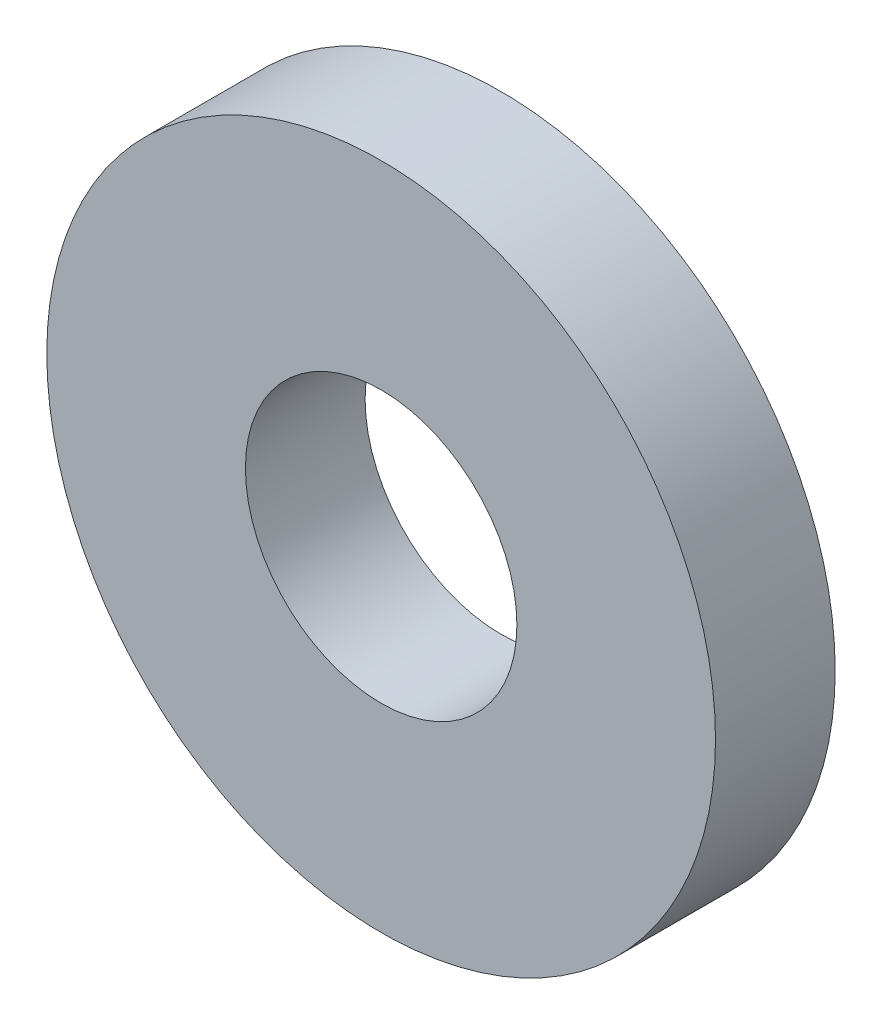
ISO-10303-21;
HEADER;
FILE_DESCRIPTION(('STEP AP214'),'2;1');
FILE_NAME('part.step','',(''),(''),'','','');
FILE_SCHEMA(('AUTOMOTIVE_DESIGN { 1 0 10303 214 1 1 1 1 }'));
ENDSEC;
DATA;
#1=APPLICATION_CONTEXT('core data for automotive mechanical design processes');
#2=APPLICATION_PROTOCOL_DEFINITION('international standard','automotive_design',2000,#1);
#3=PRODUCT_CONTEXT('',#1,'mechanical');
#4=PRODUCT('Part','Part','',(#3));
#5=PRODUCT_RELATED_PRODUCT_CATEGORY('part','',(#4));
#6=PRODUCT_DEFINITION_FORMATION('','',#4);
#7=PRODUCT_DEFINITION_CONTEXT('part definition',#1,'design');
#8=PRODUCT_DEFINITION('design','',#6,#7);
#9=PRODUCT_DEFINITION_SHAPE('','',#8);
#10=(LENGTH_UNIT() NAMED_UNIT(*) SI_UNIT(.MILLI.,.METRE.));
#11=(NAMED_UNIT(*) PLANE_ANGLE_UNIT() SI_UNIT($,.RADIAN.));
#12=(NAMED_UNIT(*) SI_UNIT($,.STERADIAN.) SOLID_ANGLE_UNIT());
#13=UNCERTAINTY_MEASURE_WITH_UNIT(LENGTH_MEASURE(1.E-05),#10,'distance_accuracy_value','');
#14=(GEOMETRIC_REPRESENTATION_CONTEXT(3) GLOBAL_UNCERTAINTY_ASSIGNED_CONTEXT((#13)) GLOBAL_UNIT_ASSIGNED_CONTEXT((#10,
#11,#12)) REPRESENTATION_CONTEXT('',''));
#15=CARTESIAN_POINT('',(0.,0.,0.));
#16=DIRECTION('',(0.,0.,1.));
#17=DIRECTION('',(1.,0.,0.));
#18=AXIS2_PLACEMENT_3D('',#15,#16,#17);
#19=CARTESIAN_POINT('',(0.,0.,1.13665));
#20=DIRECTION('',(0.,0.,1.));
#21=DIRECTION('',(1.,0.,0.));
#22=AXIS2_PLACEMENT_3D('',#19,#20,#21);
#23=PLANE('',#22);
#24=CARTESIAN_POINT('',(0.,0.,1.13665));
#25=DIRECTION('',(0.,0.,1.));
#26=DIRECTION('',(1.,0.,0.));
#27=AXIS2_PLACEMENT_3D('',#24,#25,#26);
#28=CIRCLE('',#27,6.35);
#29=CARTESIAN_POINT('',(6.35,0.,1.13665));
#30=VERTEX_POINT('',#29);
#31=EDGE_CURVE('E10',#30,#30,#28,.T.);
#32=ORIENTED_EDGE('',*,*,#31,.T.);
#33=EDGE_LOOP('',(#32));
#34=FACE_BOUND('',#33,.T.);
#35=CARTESIAN_POINT('',(0.,0.,1.13665));
#36=DIRECTION('',(0.,0.,1.));
#37=DIRECTION('',(1.,0.,0.));
#38=AXIS2_PLACEMENT_3D('',#35,#36,#37);
#39=CIRCLE('',#38,2.5781);
#40=CARTESIAN_POINT('',(2.5781,0.,1.13665));
#41=VERTEX_POINT('',#40);
#42=EDGE_CURVE('E41',#41,#41,#39,.T.);
#43=ORIENTED_EDGE('',*,*,#42,.F.);
#44=EDGE_LOOP('',(#43));
#45=FACE_BOUND('',#44,.T.);
#46=ADVANCED_FACE('F30',(#34,#45),#23,.T.);
#47=CARTESIAN_POINT('',(0.,0.,-1.13665));
#48=DIRECTION('',(0.,0.,1.));
#49=DIRECTION('',(1.,0.,0.));
#50=AXIS2_PLACEMENT_3D('',#47,#48,#49);
#51=PLANE('',#50);
#52=CARTESIAN_POINT('',(0.,0.,-1.13665));
#53=DIRECTION('',(0.,0.,1.));
#54=DIRECTION('',(1.,0.,0.));
#55=AXIS2_PLACEMENT_3D('',#52,#53,#54);
#56=CIRCLE('',#55,6.35);
#57=CARTESIAN_POINT('',(6.35,0.,-1.13665));
#58=VERTEX_POINT('',#57);
#59=EDGE_CURVE('E34',#58,#58,#56,.T.);
#60=ORIENTED_EDGE('',*,*,#59,.F.);
#61=EDGE_LOOP('',(#60));
#62=FACE_BOUND('',#61,.T.);
#63=CARTESIAN_POINT('',(0.,0.,-1.13665));
#64=DIRECTION('',(0.,0.,1.));
#65=DIRECTION('',(1.,0.,0.));
#66=AXIS2_PLACEMENT_3D('',#63,#64,#65);
#67=CIRCLE('',#66,2.5781);
#68=CARTESIAN_POINT('',(2.5781,0.,-1.13665));
#69=VERTEX_POINT('',#68);
#70=EDGE_CURVE('E43',#69,#69,#67,.T.);
#71=ORIENTED_EDGE('',*,*,#70,.T.);
#72=EDGE_LOOP('',(#71));
#73=FACE_BOUND('',#72,.T.);
#74=ADVANCED_FACE('F53',(#62,#73),#51,.F.);
#75=CARTESIAN_POINT('',(0.,0.,1.13665));
#76=DIRECTION('',(0.,0.,-1.));
#77=DIRECTION('',(-1.,0.,0.));
#78=AXIS2_PLACEMENT_3D('',#75,#76,#77);
#79=CYLINDRICAL_SURFACE('',#78,6.35);
#80=ORIENTED_EDGE('',*,*,#31,.F.);
#81=EDGE_LOOP('',(#80));
#82=FACE_BOUND('',#81,.T.);
#83=ORIENTED_EDGE('',*,*,#59,.T.);
#84=EDGE_LOOP('',(#83));
#85=FACE_BOUND('',#84,.T.);
#86=ADVANCED_FACE('F32',(#82,#85),#79,.T.);
#87=CARTESIAN_POINT('',(0.,0.,1.13665));
#88=DIRECTION('',(0.,0.,-1.));
#89=DIRECTION('',(-1.,0.,0.));
#90=AXIS2_PLACEMENT_3D('',#87,#88,#89);
#91=CYLINDRICAL_SURFACE('',#90,2.5781);
#92=ORIENTED_EDGE('',*,*,#42,.T.);
#93=EDGE_LOOP('',(#92));
#94=FACE_BOUND('',#93,.T.);
#95=ORIENTED_EDGE('',*,*,#70,.F.);
#96=EDGE_LOOP('',(#95));
#97=FACE_BOUND('',#96,.T.);
#98=ADVANCED_FACE('F49',(#94,#97),#91,.F.);
#99=CLOSED_SHELL('',(#46,#74,#86,#98));
#100=MANIFOLD_SOLID_BREP('B2',#99);
#101=ADVANCED_BREP_SHAPE_REPRESENTATION('',(#18,#100),#14);
#102=SHAPE_DEFINITION_REPRESENTATION(#9,#101);
ENDSEC;
END-ISO-10303-21;
